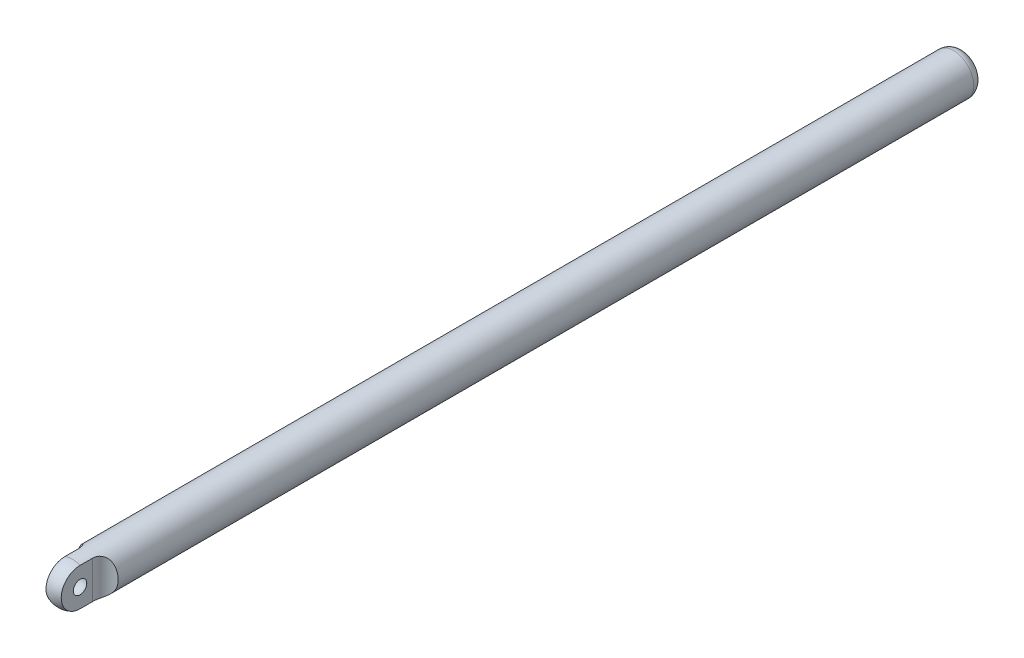
ISO-10303-21;
HEADER;
FILE_DESCRIPTION(('STEP AP214'),'2;1');
FILE_NAME('part.step','',(''),(''),'','','');
FILE_SCHEMA(('AUTOMOTIVE_DESIGN { 1 0 10303 214 1 1 1 1 }'));
ENDSEC;
DATA;
#1=APPLICATION_CONTEXT('core data for automotive mechanical design processes');
#2=APPLICATION_PROTOCOL_DEFINITION('international standard','automotive_design',2000,#1);
#3=PRODUCT_CONTEXT('',#1,'mechanical');
#4=PRODUCT('Part','Part','',(#3));
#5=PRODUCT_RELATED_PRODUCT_CATEGORY('part','',(#4));
#6=PRODUCT_DEFINITION_FORMATION('','',#4);
#7=PRODUCT_DEFINITION_CONTEXT('part definition',#1,'design');
#8=PRODUCT_DEFINITION('design','',#6,#7);
#9=PRODUCT_DEFINITION_SHAPE('','',#8);
#10=(LENGTH_UNIT() NAMED_UNIT(*) SI_UNIT(.MILLI.,.METRE.));
#11=(NAMED_UNIT(*) PLANE_ANGLE_UNIT() SI_UNIT($,.RADIAN.));
#12=(NAMED_UNIT(*) SI_UNIT($,.STERADIAN.) SOLID_ANGLE_UNIT());
#13=UNCERTAINTY_MEASURE_WITH_UNIT(LENGTH_MEASURE(1.E-05),#10,'distance_accuracy_value','');
#14=(GEOMETRIC_REPRESENTATION_CONTEXT(3) GLOBAL_UNCERTAINTY_ASSIGNED_CONTEXT((#13)) GLOBAL_UNIT_ASSIGNED_CONTEXT((#10,
#11,#12)) REPRESENTATION_CONTEXT('',''));
#15=CARTESIAN_POINT('',(0.,0.,0.));
#16=DIRECTION('',(0.,0.,1.));
#17=DIRECTION('',(1.,0.,0.));
#18=AXIS2_PLACEMENT_3D('',#15,#16,#17);
#19=CARTESIAN_POINT('',(0.,0.,351.1));
#20=DIRECTION('',(0.,0.,-1.));
#21=DIRECTION('',(-1.,0.,0.));
#22=AXIS2_PLACEMENT_3D('',#19,#20,#21);
#23=CYLINDRICAL_SURFACE('',#22,8.);
#24=CARTESIAN_POINT('',(0.,0.,4.));
#25=DIRECTION('',(0.,0.,1.));
#26=DIRECTION('',(1.,0.,0.));
#27=AXIS2_PLACEMENT_3D('',#24,#25,#26);
#28=CIRCLE('',#27,8.);
#29=CARTESIAN_POINT('',(8.,0.,4.));
#30=VERTEX_POINT('',#29);
#31=EDGE_CURVE('E108',#30,#30,#28,.T.);
#32=ORIENTED_EDGE('',*,*,#31,.T.);
#33=EDGE_LOOP('',(#32));
#34=FACE_BOUND('',#33,.T.);
#35=DIRECTION('',(0.,0.,-1.));
#36=VECTOR('',#35,1.);
#37=CARTESIAN_POINT('',(3.,-7.41619848709566,351.1));
#38=LINE('',#37,#36);
#39=CARTESIAN_POINT('',(3.,-7.41619848709566,351.1));
#40=VERTEX_POINT('',#39);
#41=CARTESIAN_POINT('',(3.,-7.41619848709566,346.1));
#42=VERTEX_POINT('',#41);
#43=EDGE_CURVE('E90',#40,#42,#38,.T.);
#44=ORIENTED_EDGE('',*,*,#43,.F.);
#45=CARTESIAN_POINT('',(0.,0.,351.1));
#46=DIRECTION('',(0.,0.,1.));
#47=DIRECTION('',(1.,0.,0.));
#48=AXIS2_PLACEMENT_3D('',#45,#46,#47);
#49=CIRCLE('',#48,8.);
#50=CARTESIAN_POINT('',(-3.,-7.41619848709566,351.1));
#51=VERTEX_POINT('',#50);
#52=EDGE_CURVE('E101',#51,#40,#49,.T.);
#53=ORIENTED_EDGE('',*,*,#52,.F.);
#54=DIRECTION('',(0.,0.,-1.));
#55=VECTOR('',#54,1.);
#56=CARTESIAN_POINT('',(-3.,-7.41619848709566,351.1));
#57=LINE('',#56,#55);
#58=CARTESIAN_POINT('',(-3.,-7.41619848709566,346.1));
#59=VERTEX_POINT('',#58);
#60=EDGE_CURVE('E117',#51,#59,#57,.T.);
#61=ORIENTED_EDGE('',*,*,#60,.T.);
#62=CARTESIAN_POINT('',(-3.,-7.41619848709566,346.1));
#63=CARTESIAN_POINT('',(-2.99998194882976,-7.41618096705285,345.971177061632));
#64=CARTESIAN_POINT('',(-3.00497786819728,-7.41418402823996,345.842353971101));
#65=CARTESIAN_POINT('',(-3.02486952777117,-7.40610410713607,345.585598718899));
#66=CARTESIAN_POINT('',(-3.03976562706393,-7.40002097663597,345.457666589715));
#67=CARTESIAN_POINT('',(-3.0793359113478,-7.38363879843656,345.20355285365));
#68=CARTESIAN_POINT('',(-3.10401325945122,-7.37333838689491,345.077371826726));
#69=CARTESIAN_POINT('',(-3.16288242047676,-7.34827900183658,344.827703273646));
#70=CARTESIAN_POINT('',(-3.19707393743654,-7.33352016700924,344.704215663833));
#71=CARTESIAN_POINT('',(-3.27464331438398,-7.29921285889115,344.460685014659));
#72=CARTESIAN_POINT('',(-3.31803147897494,-7.27965900902252,344.34064601214));
#73=CARTESIAN_POINT('',(-3.41346540886279,-7.23540040026642,344.105043124346));
#74=CARTESIAN_POINT('',(-3.46551097188766,-7.21069576171888,343.989479134595));
#75=CARTESIAN_POINT('',(-3.57756979179812,-7.15575868477292,343.76376948876));
#76=CARTESIAN_POINT('',(-3.63757655317329,-7.12553074530883,343.653619514755));
#77=CARTESIAN_POINT('',(-3.76479736496716,-7.0591391619461,343.439441504154));
#78=CARTESIAN_POINT('',(-3.83201123796436,-7.02297566415478,343.335413316951));
#79=CARTESIAN_POINT('',(-3.97157492861813,-6.94498928163802,343.135816819865));
#80=CARTESIAN_POINT('',(-4.04382479012859,-6.90326674201873,343.04013937972));
#81=CARTESIAN_POINT('',(-4.19336889552486,-6.81346173770795,342.855985770153));
#82=CARTESIAN_POINT('',(-4.2706630516339,-6.76537938366993,342.767509475482));
#83=CARTESIAN_POINT('',(-4.42917619875802,-6.66268067789855,342.598190777653));
#84=CARTESIAN_POINT('',(-4.51039535658367,-6.60806404831597,342.517348699379));
#85=CARTESIAN_POINT('',(-4.6755698352262,-6.49224295174608,342.363571465479));
#86=CARTESIAN_POINT('',(-4.75952518172602,-6.43103842290975,342.2906363841));
#87=CARTESIAN_POINT('',(-4.92871800997639,-6.30230143622583,342.152964574754));
#88=CARTESIAN_POINT('',(-5.0139509523302,-6.23478827798142,342.088204180751));
#89=CARTESIAN_POINT('',(-5.18478147239174,-6.09346613735861,341.966533728878));
#90=CARTESIAN_POINT('',(-5.27037904092626,-6.01965731248715,341.909623474704));
#91=CARTESIAN_POINT('',(-5.44087411333283,-5.86600867074744,341.803377243902));
#92=CARTESIAN_POINT('',(-5.52577151424527,-5.78616798383459,341.75404236308));
#93=CARTESIAN_POINT('',(-5.69389479796841,-5.62080741927391,341.662540885026));
#94=CARTESIAN_POINT('',(-5.77712033278823,-5.53528637491749,341.620375766788));
#95=CARTESIAN_POINT('',(-5.96957845036343,-5.32826770075513,341.529186410563));
#96=CARTESIAN_POINT('',(-6.0777827837662,-5.20460698040788,341.482881392081));
#97=CARTESIAN_POINT('',(-6.28790084602496,-4.94871111682007,341.400909908119));
#98=CARTESIAN_POINT('',(-6.38981273893175,-4.81647349395214,341.365246536035));
#99=CARTESIAN_POINT('',(-6.58622343407411,-4.54421479975277,341.302930825186));
#100=CARTESIAN_POINT('',(-6.68070809243919,-4.40417970593842,341.276295373783));
#101=CARTESIAN_POINT('',(-6.86110909142168,-4.11750952606279,341.230545324478));
#102=CARTESIAN_POINT('',(-6.94702359993419,-3.97087303845457,341.211432332146));
#103=CARTESIAN_POINT('',(-7.13015208307657,-3.63405768599302,341.175148655313));
#104=CARTESIAN_POINT('',(-7.2247219549862,-3.44225205310019,341.159694065235));
#105=CARTESIAN_POINT('',(-7.39833434257076,-3.05130048295832,341.135558283037));
#106=CARTESIAN_POINT('',(-7.47737206679697,-2.85215230306702,341.126879178613));
#107=CARTESIAN_POINT('',(-7.61922825910209,-2.4480985030995,341.114010970235));
#108=CARTESIAN_POINT('',(-7.6820519414675,-2.24319475752416,341.109820421434));
#109=CARTESIAN_POINT('',(-7.79104329491507,-1.82906797955355,341.10407065796));
#110=CARTESIAN_POINT('',(-7.83721690795037,-1.61984651627033,341.10251050384));
#111=CARTESIAN_POINT('',(-7.91656052534341,-1.17639857622754,341.100520220063));
#112=CARTESIAN_POINT('',(-7.94787850252648,-0.941834712386469,341.100224502896));
#113=CARTESIAN_POINT('',(-7.97916098716532,-0.588985804709407,341.100034384794));
#114=CARTESIAN_POINT('',(-7.98697273265946,-0.471344664553379,341.100013128681));
#115=CARTESIAN_POINT('',(-7.99739259860079,-0.235808045346252,341.099999093699));
#116=CARTESIAN_POINT('',(-7.99999965513553,-0.117912519224636,341.100006320649));
#117=CARTESIAN_POINT('',(-8.,0.,341.1));
#118=B_SPLINE_CURVE_WITH_KNOTS('',3,(#62,#63,#64,#65,#66,#67,#68,#69,#70,#71,#72,#73,#74,#75,
#76,#77,#78,#79,#80,#81,#82,#83,#84,#85,#86,#87,#88,#89,#90,#91,#92,#93,#94,#95,#96,#97,#98,#99,
#100,#101,#102,#103,#104,#105,#106,#107,#108,#109,#110,#111,#112,#113,#114,#115,#116,#117),
.UNSPECIFIED.,.F.,.F.,(4,2,2,2,2,2,2,2,2,2,2,2,2,2,2,2,2,2,2,2,2,2,2,2,2,2,2,4),(0.,
0.386357129072136,0.772728272349762,1.1592244644591,1.54570863496851,1.9326281619495,
2.31953865018729,2.70613537904259,3.0927225930147,3.47309396630354,3.85345872243815,
4.23383965812224,4.61422416523903,4.993480876017,5.37272810121374,5.75203013441183,
6.1314103161512,6.64281191115162,7.15436201979303,7.66686380513319,8.17947491805619,
8.82183344016124,9.46438981082349,10.1067392830653,10.748859290995,11.4577665415346,
11.8113690731066,12.1650438786666),.UNSPECIFIED.);
#119=CARTESIAN_POINT('',(-8.,0.,341.1));
#120=VERTEX_POINT('',#119);
#121=EDGE_CURVE('E11',#59,#120,#118,.T.);
#122=ORIENTED_EDGE('',*,*,#121,.T.);
#123=CARTESIAN_POINT('',(-8.,0.,341.1));
#124=CARTESIAN_POINT('',(-7.99999993634802,0.105590898577491,341.100004169011));
#125=CARTESIAN_POINT('',(-7.99790919883449,0.211170562631199,341.099999467842));
#126=CARTESIAN_POINT('',(-7.98955111469173,0.422164043564904,341.100008394338));
#127=CARTESIAN_POINT('',(-7.98328378352244,0.527577861057346,341.100022021935));
#128=CARTESIAN_POINT('',(-7.95822699071099,0.843318765558405,341.100144486313));
#129=CARTESIAN_POINT('',(-7.9331827260666,1.05318341235509,341.100334880221));
#130=CARTESIAN_POINT('',(-7.86634542338945,1.47167549475288,341.101674771502));
#131=CARTESIAN_POINT('',(-7.82443908771539,1.68028467228079,341.102830814856));
#132=CARTESIAN_POINT('',(-7.72414979201249,2.09349113572378,341.107362980372));
#133=CARTESIAN_POINT('',(-7.66576657183926,2.29808835824176,341.110739137587));
#134=CARTESIAN_POINT('',(-7.52894158126263,2.71399755647434,341.121737522843));
#135=CARTESIAN_POINT('',(-7.44950833935055,2.9249784059873,341.129601813349));
#136=CARTESIAN_POINT('',(-7.27325001708437,3.3392363392571,341.152300900211));
#137=CARTESIAN_POINT('',(-7.17642154377167,3.54251191070725,341.16713705735));
#138=CARTESIAN_POINT('',(-6.96683047170462,3.93869275041139,341.206750431037));
#139=CARTESIAN_POINT('',(-6.8541306101608,4.13163490783374,341.231489181372));
#140=CARTESIAN_POINT('',(-6.61411191836184,4.50586723663474,341.294307795581));
#141=CARTESIAN_POINT('',(-6.48680212792732,4.6871645060592,341.332379439397));
#142=CARTESIAN_POINT('',(-6.26635012856212,4.97528186998459,341.409269839622));
#143=CARTESIAN_POINT('',(-6.17670063322342,5.08609712266518,341.4432353453));
#144=CARTESIAN_POINT('',(-5.99312946564096,5.30116600959399,341.519351676194));
#145=CARTESIAN_POINT('',(-5.89920906948126,5.40542158187627,341.561500068627));
#146=CARTESIAN_POINT('',(-5.70825827882474,5.60669455264395,341.654867207908));
#147=CARTESIAN_POINT('',(-5.6112294055359,5.70371541653058,341.706081572003));
#148=CARTESIAN_POINT('',(-5.41538428380538,5.88998073897382,341.818353396964));
#149=CARTESIAN_POINT('',(-5.31656799052774,5.97922500213326,341.879411105047));
#150=CARTESIAN_POINT('',(-5.11795671968779,6.15010701316212,342.012431120522));
#151=CARTESIAN_POINT('',(-5.01816017852227,6.23167908624495,342.084475778608));
#152=CARTESIAN_POINT('',(-4.82016559467587,6.38606025098085,342.239372196157));
#153=CARTESIAN_POINT('',(-4.72196756699294,6.4588692604559,342.322224056952));
#154=CARTESIAN_POINT('',(-4.52908422092302,6.59555684011479,342.498636560114));
#155=CARTESIAN_POINT('',(-4.43439798708288,6.65943774986474,342.592194385303));
#156=CARTESIAN_POINT('',(-4.25038684548178,6.77836387162581,342.789622054764));
#157=CARTESIAN_POINT('',(-4.16106133124359,6.83341008432183,342.893490728991));
#158=CARTESIAN_POINT('',(-4.00002292575877,6.92874273737835,343.097509002474));
#159=CARTESIAN_POINT('',(-3.9274923887715,6.97001105021593,343.196558263437));
#160=CARTESIAN_POINT('',(-3.78895813628082,7.04627916161328,343.401405669518));
#161=CARTESIAN_POINT('',(-3.72295425299788,7.08127912133129,343.507203641033));
#162=CARTESIAN_POINT('',(-3.59836963004581,7.14539359756557,343.724840957832));
#163=CARTESIAN_POINT('',(-3.53979191498217,7.17450571887853,343.836682738418));
#164=CARTESIAN_POINT('',(-3.43085959026302,7.22723089842974,344.065542749084));
#165=CARTESIAN_POINT('',(-3.38050480367211,7.25084407499522,344.182560867714));
#166=CARTESIAN_POINT('',(-3.28976794622583,7.29245207607916,344.417967061106));
#167=CARTESIAN_POINT('',(-3.24917093042018,7.31057087513551,344.536250535755));
#168=CARTESIAN_POINT('',(-3.17683382647123,7.34229447154521,344.776083436988));
#169=CARTESIAN_POINT('',(-3.14509355584091,7.35589936190556,344.897632796225));
#170=CARTESIAN_POINT('',(-3.09084104909216,7.37885953007686,345.142962890584));
#171=CARTESIAN_POINT('',(-3.06831464655881,7.38822133408962,345.266739892411));
#172=CARTESIAN_POINT('',(-3.03265119192015,7.40293196225855,345.515824860602));
#173=CARTESIAN_POINT('',(-3.01950922431935,7.40828288735562,345.64113199046));
#174=CARTESIAN_POINT('',(-3.00740992325215,7.41319752069493,345.822258731533));
#175=CARTESIAN_POINT('',(-3.00462970342662,7.41432433240352,345.877806790206));
#176=CARTESIAN_POINT('',(-3.0009260170494,7.41582403166414,345.988901217524));
#177=CARTESIAN_POINT('',(-3.00000009412967,7.41619791661415,346.044447490802));
#178=CARTESIAN_POINT('',(-3.,7.41619848709566,346.1));
#179=B_SPLINE_CURVE_WITH_KNOTS('',3,(#123,#124,#125,#126,#127,#128,#129,#130,#131,#132,#133,
#134,#135,#136,#137,#138,#139,#140,#141,#142,#143,#144,#145,#146,#147,#148,#149,#150,#151,#152,
#153,#154,#155,#156,#157,#158,#159,#160,#161,#162,#163,#164,#165,#166,#167,#168,#169,#170,#171,
#172,#173,#174,#175,#176,#177,#178),.UNSPECIFIED.,.F.,.F.,(4,2,2,2,2,2,2,2,2,2,2,2,2,2,2,2,2,2,
2,2,2,2,2,2,2,2,2,4),(0.,0.316729562177747,0.633457951965692,1.26680073250047,1.90447201617216,
2.54215336824463,3.21800469590686,3.89398799250792,4.56737055336253,5.24033868603008,
5.67954341079974,6.11861775881925,6.55748042240496,6.99635410980625,7.43869556038723,
7.88104115882278,8.32327062448777,8.76544996448038,9.15351841954077,9.5415768959981,
9.92979292053024,10.3180005905923,10.6966537499446,11.0752991068382,11.4533600842844,
11.8312228907269,11.9980801523305,12.1647162332401),.UNSPECIFIED.);
#180=CARTESIAN_POINT('',(-3.,7.41619848709566,346.1));
#181=VERTEX_POINT('',#180);
#182=EDGE_CURVE('E50',#120,#181,#179,.T.);
#183=ORIENTED_EDGE('',*,*,#182,.T.);
#184=DIRECTION('',(0.,0.,-1.));
#185=VECTOR('',#184,1.);
#186=CARTESIAN_POINT('',(-3.,7.41619848709566,351.1));
#187=LINE('',#186,#185);
#188=CARTESIAN_POINT('',(-3.,7.41619848709566,351.1));
#189=VERTEX_POINT('',#188);
#190=EDGE_CURVE('E103',#181,#189,#187,.F.);
#191=ORIENTED_EDGE('',*,*,#190,.T.);
#192=CARTESIAN_POINT('',(3.,7.41619848709566,351.1));
#193=VERTEX_POINT('',#192);
#194=EDGE_CURVE('E109',#193,#189,#49,.T.);
#195=ORIENTED_EDGE('',*,*,#194,.F.);
#196=DIRECTION('',(0.,0.,-1.));
#197=VECTOR('',#196,1.);
#198=CARTESIAN_POINT('',(3.,7.41619848709566,351.1));
#199=LINE('',#198,#197);
#200=CARTESIAN_POINT('',(3.,7.41619848709566,346.1));
#201=VERTEX_POINT('',#200);
#202=EDGE_CURVE('E92',#201,#193,#199,.F.);
#203=ORIENTED_EDGE('',*,*,#202,.F.);
#204=CARTESIAN_POINT('',(3.,7.41619848709566,346.1));
#205=CARTESIAN_POINT('',(2.99998194882976,7.41618096705285,345.971177061632));
#206=CARTESIAN_POINT('',(3.00497786819728,7.41418402823996,345.842353971101));
#207=CARTESIAN_POINT('',(3.02486952777117,7.40610410713607,345.585598718899));
#208=CARTESIAN_POINT('',(3.03976562706393,7.40002097663597,345.457666589715));
#209=CARTESIAN_POINT('',(3.0793359113478,7.38363879843656,345.20355285365));
#210=CARTESIAN_POINT('',(3.10401325945122,7.37333838689491,345.077371826726));
#211=CARTESIAN_POINT('',(3.16288242047676,7.34827900183658,344.827703273646));
#212=CARTESIAN_POINT('',(3.19707393743654,7.33352016700924,344.704215663833));
#213=CARTESIAN_POINT('',(3.27464331438398,7.29921285889115,344.460685014659));
#214=CARTESIAN_POINT('',(3.31803147897494,7.27965900902252,344.34064601214));
#215=CARTESIAN_POINT('',(3.41346540886279,7.23540040026642,344.105043124346));
#216=CARTESIAN_POINT('',(3.46551097188766,7.21069576171888,343.989479134595));
#217=CARTESIAN_POINT('',(3.57756979179812,7.15575868477292,343.76376948876));
#218=CARTESIAN_POINT('',(3.63757655317329,7.12553074530883,343.653619514755));
#219=CARTESIAN_POINT('',(3.76479736496716,7.0591391619461,343.439441504154));
#220=CARTESIAN_POINT('',(3.83201123796436,7.02297566415478,343.335413316951));
#221=CARTESIAN_POINT('',(3.97157492861813,6.94498928163802,343.135816819865));
#222=CARTESIAN_POINT('',(4.04382479012859,6.90326674201873,343.04013937972));
#223=CARTESIAN_POINT('',(4.19336889552486,6.81346173770795,342.855985770153));
#224=CARTESIAN_POINT('',(4.2706630516339,6.76537938366993,342.767509475482));
#225=CARTESIAN_POINT('',(4.42917619875802,6.66268067789855,342.598190777653));
#226=CARTESIAN_POINT('',(4.51039535658367,6.60806404831597,342.517348699379));
#227=CARTESIAN_POINT('',(4.6755698352262,6.49224295174608,342.363571465479));
#228=CARTESIAN_POINT('',(4.75952518172602,6.43103842290975,342.2906363841));
#229=CARTESIAN_POINT('',(4.92871800997639,6.30230143622583,342.152964574754));
#230=CARTESIAN_POINT('',(5.0139509523302,6.23478827798142,342.088204180751));
#231=CARTESIAN_POINT('',(5.18478147239174,6.09346613735861,341.966533728878));
#232=CARTESIAN_POINT('',(5.27037904092626,6.01965731248715,341.909623474704));
#233=CARTESIAN_POINT('',(5.44087411333283,5.86600867074744,341.803377243902));
#234=CARTESIAN_POINT('',(5.52577151424527,5.78616798383459,341.75404236308));
#235=CARTESIAN_POINT('',(5.69389479796841,5.62080741927391,341.662540885026));
#236=CARTESIAN_POINT('',(5.77712033278823,5.53528637491749,341.620375766788));
#237=CARTESIAN_POINT('',(5.96957845036343,5.32826770075513,341.529186410563));
#238=CARTESIAN_POINT('',(6.0777827837662,5.20460698040788,341.482881392081));
#239=CARTESIAN_POINT('',(6.28790084602496,4.94871111682007,341.400909908119));
#240=CARTESIAN_POINT('',(6.38981273893175,4.81647349395214,341.365246536035));
#241=CARTESIAN_POINT('',(6.58622343407411,4.54421479975277,341.302930825186));
#242=CARTESIAN_POINT('',(6.68070809243919,4.40417970593842,341.276295373783));
#243=CARTESIAN_POINT('',(6.86110909142168,4.11750952606279,341.230545324478));
#244=CARTESIAN_POINT('',(6.94702359993419,3.97087303845457,341.211432332146));
#245=CARTESIAN_POINT('',(7.13015208307657,3.63405768599302,341.175148655313));
#246=CARTESIAN_POINT('',(7.2247219549862,3.44225205310019,341.159694065235));
#247=CARTESIAN_POINT('',(7.39833434257076,3.05130048295832,341.135558283037));
#248=CARTESIAN_POINT('',(7.47737206679697,2.85215230306702,341.126879178613));
#249=CARTESIAN_POINT('',(7.61922825910209,2.4480985030995,341.114010970235));
#250=CARTESIAN_POINT('',(7.6820519414675,2.24319475752416,341.109820421434));
#251=CARTESIAN_POINT('',(7.79104329491507,1.82906797955355,341.10407065796));
#252=CARTESIAN_POINT('',(7.83721690795037,1.61984651627033,341.10251050384));
#253=CARTESIAN_POINT('',(7.91656052534341,1.17639857622754,341.100520220063));
#254=CARTESIAN_POINT('',(7.94787850252648,0.941834712386469,341.100224502896));
#255=CARTESIAN_POINT('',(7.97916098716532,0.588985804709407,341.100034384794));
#256=CARTESIAN_POINT('',(7.98697273265946,0.471344664553379,341.100013128681));
#257=CARTESIAN_POINT('',(7.99739259860079,0.235808045346252,341.099999093699));
#258=CARTESIAN_POINT('',(7.99999965513553,0.117912519224636,341.100006320649));
#259=CARTESIAN_POINT('',(8.,0.,341.1));
#260=B_SPLINE_CURVE_WITH_KNOTS('',3,(#204,#205,#206,#207,#208,#209,#210,#211,#212,#213,#214,
#215,#216,#217,#218,#219,#220,#221,#222,#223,#224,#225,#226,#227,#228,#229,#230,#231,#232,#233,
#234,#235,#236,#237,#238,#239,#240,#241,#242,#243,#244,#245,#246,#247,#248,#249,#250,#251,#252,
#253,#254,#255,#256,#257,#258,#259),.UNSPECIFIED.,.F.,.F.,(4,2,2,2,2,2,2,2,2,2,2,2,2,2,2,2,2,2,
2,2,2,2,2,2,2,2,2,4),(0.,0.386357129072136,0.772728272349762,1.1592244644591,1.54570863496851,
1.9326281619495,2.31953865018729,2.70613537904259,3.0927225930147,3.47309396630354,
3.85345872243815,4.23383965812224,4.61422416523903,4.993480876017,5.37272810121374,
5.75203013441183,6.1314103161512,6.64281191115162,7.15436201979303,7.66686380513319,
8.17947491805619,8.82183344016124,9.46438981082349,10.1067392830653,10.748859290995,
11.4577665415346,11.8113690731066,12.1650438786666),.UNSPECIFIED.);
#261=CARTESIAN_POINT('',(8.,0.,341.1));
#262=VERTEX_POINT('',#261);
#263=EDGE_CURVE('E62',#201,#262,#260,.T.);
#264=ORIENTED_EDGE('',*,*,#263,.T.);
#265=CARTESIAN_POINT('',(8.,0.,341.1));
#266=CARTESIAN_POINT('',(7.99999993634802,-0.105590898577491,341.100004169011));
#267=CARTESIAN_POINT('',(7.99790919883449,-0.211170562631199,341.099999467842));
#268=CARTESIAN_POINT('',(7.98955111469173,-0.422164043564904,341.100008394338));
#269=CARTESIAN_POINT('',(7.98328378352244,-0.527577861057346,341.100022021935));
#270=CARTESIAN_POINT('',(7.95822699071099,-0.843318765558405,341.100144486313));
#271=CARTESIAN_POINT('',(7.9331827260666,-1.05318341235509,341.100334880221));
#272=CARTESIAN_POINT('',(7.86634542338945,-1.47167549475288,341.101674771502));
#273=CARTESIAN_POINT('',(7.82443908771539,-1.68028467228079,341.102830814856));
#274=CARTESIAN_POINT('',(7.72414979201249,-2.09349113572378,341.107362980372));
#275=CARTESIAN_POINT('',(7.66576657183926,-2.29808835824176,341.110739137587));
#276=CARTESIAN_POINT('',(7.52894158126263,-2.71399755647434,341.121737522843));
#277=CARTESIAN_POINT('',(7.44950833935055,-2.9249784059873,341.129601813349));
#278=CARTESIAN_POINT('',(7.27325001708437,-3.3392363392571,341.152300900211));
#279=CARTESIAN_POINT('',(7.17642154377167,-3.54251191070725,341.16713705735));
#280=CARTESIAN_POINT('',(6.96683047170462,-3.93869275041139,341.206750431037));
#281=CARTESIAN_POINT('',(6.8541306101608,-4.13163490783374,341.231489181372));
#282=CARTESIAN_POINT('',(6.61411191836184,-4.50586723663474,341.294307795581));
#283=CARTESIAN_POINT('',(6.48680212792732,-4.6871645060592,341.332379439397));
#284=CARTESIAN_POINT('',(6.26635012856212,-4.97528186998459,341.409269839622));
#285=CARTESIAN_POINT('',(6.17670063322342,-5.08609712266518,341.4432353453));
#286=CARTESIAN_POINT('',(5.99312946564096,-5.30116600959399,341.519351676194));
#287=CARTESIAN_POINT('',(5.89920906948126,-5.40542158187627,341.561500068627));
#288=CARTESIAN_POINT('',(5.70825827882474,-5.60669455264395,341.654867207908));
#289=CARTESIAN_POINT('',(5.6112294055359,-5.70371541653058,341.706081572003));
#290=CARTESIAN_POINT('',(5.41538428380538,-5.88998073897382,341.818353396964));
#291=CARTESIAN_POINT('',(5.31656799052774,-5.97922500213326,341.879411105047));
#292=CARTESIAN_POINT('',(5.11795671968779,-6.15010701316212,342.012431120522));
#293=CARTESIAN_POINT('',(5.01816017852227,-6.23167908624495,342.084475778608));
#294=CARTESIAN_POINT('',(4.82016559467587,-6.38606025098085,342.239372196157));
#295=CARTESIAN_POINT('',(4.72196756699294,-6.4588692604559,342.322224056952));
#296=CARTESIAN_POINT('',(4.52908422092302,-6.59555684011479,342.498636560114));
#297=CARTESIAN_POINT('',(4.43439798708288,-6.65943774986474,342.592194385303));
#298=CARTESIAN_POINT('',(4.25038684548178,-6.77836387162581,342.789622054764));
#299=CARTESIAN_POINT('',(4.16106133124359,-6.83341008432183,342.893490728991));
#300=CARTESIAN_POINT('',(4.00002292575877,-6.92874273737835,343.097509002474));
#301=CARTESIAN_POINT('',(3.9274923887715,-6.97001105021593,343.196558263437));
#302=CARTESIAN_POINT('',(3.78895813628082,-7.04627916161328,343.401405669518));
#303=CARTESIAN_POINT('',(3.72295425299788,-7.08127912133129,343.507203641033));
#304=CARTESIAN_POINT('',(3.59836963004581,-7.14539359756557,343.724840957832));
#305=CARTESIAN_POINT('',(3.53979191498217,-7.17450571887853,343.836682738418));
#306=CARTESIAN_POINT('',(3.43085959026302,-7.22723089842974,344.065542749084));
#307=CARTESIAN_POINT('',(3.38050480367211,-7.25084407499522,344.182560867714));
#308=CARTESIAN_POINT('',(3.28976794622583,-7.29245207607916,344.417967061106));
#309=CARTESIAN_POINT('',(3.24917093042018,-7.31057087513551,344.536250535755));
#310=CARTESIAN_POINT('',(3.17683382647123,-7.34229447154521,344.776083436988));
#311=CARTESIAN_POINT('',(3.14509355584091,-7.35589936190556,344.897632796225));
#312=CARTESIAN_POINT('',(3.09084104909216,-7.37885953007686,345.142962890584));
#313=CARTESIAN_POINT('',(3.06831464655881,-7.38822133408962,345.266739892411));
#314=CARTESIAN_POINT('',(3.03265119192015,-7.40293196225855,345.515824860602));
#315=CARTESIAN_POINT('',(3.01950922431935,-7.40828288735562,345.64113199046));
#316=CARTESIAN_POINT('',(3.00740992325215,-7.41319752069493,345.822258731533));
#317=CARTESIAN_POINT('',(3.00462970342662,-7.41432433240352,345.877806790206));
#318=CARTESIAN_POINT('',(3.0009260170494,-7.41582403166414,345.988901217524));
#319=CARTESIAN_POINT('',(3.00000009412967,-7.41619791661415,346.044447490802));
#320=CARTESIAN_POINT('',(3.,-7.41619848709566,346.1));
#321=B_SPLINE_CURVE_WITH_KNOTS('',3,(#265,#266,#267,#268,#269,#270,#271,#272,#273,#274,#275,
#276,#277,#278,#279,#280,#281,#282,#283,#284,#285,#286,#287,#288,#289,#290,#291,#292,#293,#294,
#295,#296,#297,#298,#299,#300,#301,#302,#303,#304,#305,#306,#307,#308,#309,#310,#311,#312,#313,
#314,#315,#316,#317,#318,#319,#320),.UNSPECIFIED.,.F.,.F.,(4,2,2,2,2,2,2,2,2,2,2,2,2,2,2,2,2,2,
2,2,2,2,2,2,2,2,2,4),(0.,0.316729562177747,0.633457951965692,1.26680073250047,1.90447201617216,
2.54215336824463,3.21800469590686,3.89398799250792,4.56737055336253,5.24033868603008,
5.67954341079974,6.11861775881925,6.55748042240496,6.99635410980625,7.43869556038723,
7.88104115882278,8.32327062448777,8.76544996448038,9.15351841954077,9.5415768959981,
9.92979292053024,10.3180005905923,10.6966537499446,11.0752991068382,11.4533600842844,
11.8312228907269,11.9980801523305,12.1647162332401),.UNSPECIFIED.);
#322=EDGE_CURVE('E102',#262,#42,#321,.T.);
#323=ORIENTED_EDGE('',*,*,#322,.T.);
#324=EDGE_LOOP('',(#44,#53,#61,#122,#183,#191,#195,#203,#264,#323));
#325=FACE_BOUND('',#324,.T.);
#326=ADVANCED_FACE('F37',(#34,#325),#23,.T.);
#327=CARTESIAN_POINT('',(0.,0.,351.1));
#328=DIRECTION('',(-0.184955330817272,0.982746928564152,0.));
#329=DIRECTION('',(-0.982746928564152,-0.184955330817272,0.));
#330=AXIS2_PLACEMENT_3D('',#327,#328,#329);
#331=SPHERICAL_SURFACE('',#330,8.);
#332=CARTESIAN_POINT('',(3.,0.,351.1));
#333=DIRECTION('',(1.,0.,0.));
#334=DIRECTION('',(0.,0.,-1.));
#335=AXIS2_PLACEMENT_3D('',#332,#333,#334);
#336=CIRCLE('',#335,7.41619848709566);
#337=EDGE_CURVE('E86',#193,#40,#336,.T.);
#338=ORIENTED_EDGE('',*,*,#337,.F.);
#339=ORIENTED_EDGE('',*,*,#194,.T.);
#340=CARTESIAN_POINT('',(-3.,0.,351.1));
#341=DIRECTION('',(1.,0.,0.));
#342=DIRECTION('',(0.,0.,-1.));
#343=AXIS2_PLACEMENT_3D('',#340,#341,#342);
#344=CIRCLE('',#343,7.41619848709566);
#345=EDGE_CURVE('E98',#189,#51,#344,.T.);
#346=ORIENTED_EDGE('',*,*,#345,.T.);
#347=ORIENTED_EDGE('',*,*,#52,.T.);
#348=EDGE_LOOP('',(#338,#339,#346,#347));
#349=FACE_BOUND('',#348,.T.);
#350=ADVANCED_FACE('F106',(#349),#331,.T.);
#351=CARTESIAN_POINT('',(0.,0.,0.));
#352=DIRECTION('',(0.,0.,1.));
#353=DIRECTION('',(1.,0.,0.));
#354=AXIS2_PLACEMENT_3D('',#351,#352,#353);
#355=PLANE('',#354);
#356=CARTESIAN_POINT('',(0.,0.,0.));
#357=DIRECTION('',(0.,0.,1.));
#358=DIRECTION('',(1.,0.,0.));
#359=AXIS2_PLACEMENT_3D('',#356,#357,#358);
#360=CIRCLE('',#359,4.);
#361=CARTESIAN_POINT('',(4.,0.,0.));
#362=VERTEX_POINT('',#361);
#363=EDGE_CURVE('E112',#362,#362,#360,.F.);
#364=ORIENTED_EDGE('',*,*,#363,.T.);
#365=EDGE_LOOP('',(#364));
#366=FACE_BOUND('',#365,.T.);
#367=CARTESIAN_POINT('',(0.,0.,0.));
#368=DIRECTION('',(0.,0.,1.));
#369=DIRECTION('',(1.,0.,0.));
#370=AXIS2_PLACEMENT_3D('',#367,#368,#369);
#371=CIRCLE('',#370,3.87298334620742);
#372=CARTESIAN_POINT('',(3.87298334620742,0.,0.));
#373=VERTEX_POINT('',#372);
#374=EDGE_CURVE('E114',#373,#373,#371,.F.);
#375=ORIENTED_EDGE('',*,*,#374,.F.);
#376=EDGE_LOOP('',(#375));
#377=FACE_BOUND('',#376,.T.);
#378=ADVANCED_FACE('F159',(#366,#377),#355,.F.);
#379=CARTESIAN_POINT('',(0.,0.,1.));
#380=DIRECTION('',(1.,0.,0.));
#381=DIRECTION('',(0.,0.,1.));
#382=AXIS2_PLACEMENT_3D('',#379,#380,#381);
#383=SPHERICAL_SURFACE('',#382,4.);
#384=CARTESIAN_POINT('',(0.,0.,1.));
#385=DIRECTION('',(0.,0.,1.));
#386=DIRECTION('',(1.,0.,0.));
#387=AXIS2_PLACEMENT_3D('',#384,#385,#386);
#388=SPHERICAL_SURFACE('',#387,4.);
#389=ORIENTED_EDGE('',*,*,#374,.T.);
#390=EDGE_LOOP('',(#389));
#391=FACE_BOUND('',#390,.T.);
#392=ADVANCED_FACE('F151',(#391),#388,.F.);
#393=CARTESIAN_POINT('',(0.,0.,4.));
#394=DIRECTION('',(0.,0.,1.));
#395=DIRECTION('',(1.,0.,0.));
#396=AXIS2_PLACEMENT_3D('',#393,#394,#395);
#397=DEGENERATE_TOROIDAL_SURFACE('',#396,4.,4.,.T.);
#398=ORIENTED_EDGE('',*,*,#363,.F.);
#399=EDGE_LOOP('',(#398));
#400=FACE_BOUND('',#399,.T.);
#401=ORIENTED_EDGE('',*,*,#31,.F.);
#402=EDGE_LOOP('',(#401));
#403=FACE_BOUND('',#402,.T.);
#404=ADVANCED_FACE('F147',(#400,#403),#397,.T.);
#405=CARTESIAN_POINT('',(-3.,-8.,361.1));
#406=DIRECTION('',(1.,0.,0.));
#407=DIRECTION('',(0.,0.,-1.));
#408=AXIS2_PLACEMENT_3D('',#405,#406,#407);
#409=PLANE('',#408);
#410=CARTESIAN_POINT('',(-3.,0.,351.1));
#411=DIRECTION('',(1.,0.,0.));
#412=DIRECTION('',(0.,0.,-1.));
#413=AXIS2_PLACEMENT_3D('',#410,#411,#412);
#414=CIRCLE('',#413,2.64575131106459);
#415=CARTESIAN_POINT('',(-3.,-2.64575131106459,351.1));
#416=VERTEX_POINT('',#415);
#417=EDGE_CURVE('E127',#416,#416,#414,.T.);
#418=ORIENTED_EDGE('',*,*,#417,.T.);
#419=EDGE_LOOP('',(#418));
#420=FACE_BOUND('',#419,.T.);
#421=ORIENTED_EDGE('',*,*,#190,.F.);
#422=DIRECTION('',(0.,1.,0.));
#423=VECTOR('',#422,1.);
#424=CARTESIAN_POINT('',(-3.,-8.,346.1));
#425=LINE('',#424,#423);
#426=EDGE_CURVE('E129',#181,#59,#425,.F.);
#427=ORIENTED_EDGE('',*,*,#426,.T.);
#428=ORIENTED_EDGE('',*,*,#60,.F.);
#429=ORIENTED_EDGE('',*,*,#345,.F.);
#430=EDGE_LOOP('',(#421,#427,#428,#429));
#431=FACE_BOUND('',#430,.T.);
#432=ADVANCED_FACE('F150',(#420,#431),#409,.F.);
#433=CARTESIAN_POINT('',(3.,-8.,361.1));
#434=DIRECTION('',(1.,0.,0.));
#435=DIRECTION('',(0.,0.,-1.));
#436=AXIS2_PLACEMENT_3D('',#433,#434,#435);
#437=PLANE('',#436);
#438=CARTESIAN_POINT('',(3.,0.,351.1));
#439=DIRECTION('',(1.,0.,0.));
#440=DIRECTION('',(0.,0.,-1.));
#441=AXIS2_PLACEMENT_3D('',#438,#439,#440);
#442=CIRCLE('',#441,2.64575131106459);
#443=CARTESIAN_POINT('',(3.,-2.64575131106459,351.1));
#444=VERTEX_POINT('',#443);
#445=EDGE_CURVE('E124',#444,#444,#442,.T.);
#446=ORIENTED_EDGE('',*,*,#445,.F.);
#447=EDGE_LOOP('',(#446));
#448=FACE_BOUND('',#447,.T.);
#449=ORIENTED_EDGE('',*,*,#43,.T.);
#450=DIRECTION('',(0.,1.,0.));
#451=VECTOR('',#450,1.);
#452=CARTESIAN_POINT('',(3.,-8.,346.1));
#453=LINE('',#452,#451);
#454=EDGE_CURVE('E97',#42,#201,#453,.T.);
#455=ORIENTED_EDGE('',*,*,#454,.T.);
#456=ORIENTED_EDGE('',*,*,#202,.T.);
#457=ORIENTED_EDGE('',*,*,#337,.T.);
#458=EDGE_LOOP('',(#449,#455,#456,#457));
#459=FACE_BOUND('',#458,.T.);
#460=ADVANCED_FACE('F88',(#448,#459),#437,.T.);
#461=CARTESIAN_POINT('',(0.,0.,351.1));
#462=DIRECTION('',(1.,0.,0.));
#463=DIRECTION('',(0.,-1.,0.));
#464=AXIS2_PLACEMENT_3D('',#461,#462,#463);
#465=SPHERICAL_SURFACE('',#464,4.);
#466=CARTESIAN_POINT('',(3.,-2.64575131106459,351.1));
#467=CARTESIAN_POINT('',(2.95325632278245,-2.69875651187134,351.1));
#468=CARTESIAN_POINT('',(2.90510527447021,-2.75052029684331,351.1));
#469=CARTESIAN_POINT('',(2.80612960257577,-2.85142545255604,351.1));
#470=CARTESIAN_POINT('',(2.75530497899356,-2.90056682329681,351.1));
#471=CARTESIAN_POINT('',(2.65112332347855,-2.99608756798547,351.1));
#472=CARTESIAN_POINT('',(2.59776629154575,-3.04246694193337,351.1));
#473=CARTESIAN_POINT('',(2.48867011130152,-3.13233384188064,351.1));
#474=CARTESIAN_POINT('',(2.4329309629901,-3.17582136788002,351.1));
#475=CARTESIAN_POINT('',(2.31922699358693,-3.2597823144284,351.1));
#476=CARTESIAN_POINT('',(2.26126217249517,-3.3002557349774,351.1));
#477=CARTESIAN_POINT('',(2.14326969696134,-3.37807482070356,351.1));
#478=CARTESIAN_POINT('',(2.08324204251927,-3.41542048588072,351.1));
#479=CARTESIAN_POINT('',(1.9612924949961,-3.48687915806733,351.1));
#480=CARTESIAN_POINT('',(1.89937060191501,-3.52099216507678,351.1));
#481=CARTESIAN_POINT('',(1.77380650264688,-3.58588970804608,351.1));
#482=CARTESIAN_POINT('',(1.71016429645984,-3.61667424400594,351.1));
#483=CARTESIAN_POINT('',(1.58133832566934,-3.67482837812324,351.1));
#484=CARTESIAN_POINT('',(1.51615456106587,-3.70219797628069,351.1));
#485=CARTESIAN_POINT('',(1.38442855873451,-3.75344536048972,351.1));
#486=CARTESIAN_POINT('',(1.3178863210066,-3.7773231465413,351.1));
#487=CARTESIAN_POINT('',(1.18363027313511,-3.82151983967928,351.1));
#488=CARTESIAN_POINT('',(1.11591646299151,-3.84183874676568,351.1));
#489=CARTESIAN_POINT('',(0.97950746170912,-3.87886061118061,351.1));
#490=CARTESIAN_POINT('',(0.910812270570316,-3.89556356850914,351.1));
#491=CARTESIAN_POINT('',(0.77263345516107,-3.92530661891354,351.1));
#492=CARTESIAN_POINT('',(0.703149830890627,-3.93834671198941,351.1));
#493=CARTESIAN_POINT('',(0.563589311599921,-3.96072740748069,351.1));
#494=CARTESIAN_POINT('',(0.493512416579659,-3.9700680098961,351.1));
#495=CARTESIAN_POINT('',(0.352962184521471,-3.98502348861544,351.1));
#496=CARTESIAN_POINT('',(0.282488847483545,-3.99063836491936,351.1));
#497=CARTESIAN_POINT('',(0.141343673630413,-3.99812662061164,351.1));
#498=CARTESIAN_POINT('',(0.0706718368152065,-4.,351.1));
#499=CARTESIAN_POINT('',(-0.0706718368152065,-4.,351.1));
#500=CARTESIAN_POINT('',(-0.141343673630413,-3.99812662061164,351.1));
#501=CARTESIAN_POINT('',(-0.282488847483545,-3.99063836491936,351.1));
#502=CARTESIAN_POINT('',(-0.352962184521471,-3.98502348861544,351.1));
#503=CARTESIAN_POINT('',(-0.493512416579659,-3.9700680098961,351.1));
#504=CARTESIAN_POINT('',(-0.563589311599922,-3.96072740748069,351.1));
#505=CARTESIAN_POINT('',(-0.703149830890628,-3.93834671198941,351.1));
#506=CARTESIAN_POINT('',(-0.772633455161071,-3.92530661891354,351.1));
#507=CARTESIAN_POINT('',(-0.910812270570317,-3.89556356850913,351.1));
#508=CARTESIAN_POINT('',(-0.979507461709119,-3.87886061118061,351.1));
#509=CARTESIAN_POINT('',(-1.11591646299151,-3.84183874676568,351.1));
#510=CARTESIAN_POINT('',(-1.18363027313511,-3.82151983967928,351.1));
#511=CARTESIAN_POINT('',(-1.3178863210066,-3.7773231465413,351.1));
#512=CARTESIAN_POINT('',(-1.38442855873451,-3.75344536048972,351.1));
#513=CARTESIAN_POINT('',(-1.51615456106587,-3.70219797628069,351.1));
#514=CARTESIAN_POINT('',(-1.58133832566934,-3.67482837812324,351.1));
#515=CARTESIAN_POINT('',(-1.71016429645984,-3.61667424400594,351.1));
#516=CARTESIAN_POINT('',(-1.77380650264688,-3.58588970804608,351.1));
#517=CARTESIAN_POINT('',(-1.89937060191501,-3.52099216507678,351.1));
#518=CARTESIAN_POINT('',(-1.9612924949961,-3.48687915806733,351.1));
#519=CARTESIAN_POINT('',(-2.08324204251927,-3.41542048588072,351.1));
#520=CARTESIAN_POINT('',(-2.14326969696134,-3.37807482070356,351.1));
#521=CARTESIAN_POINT('',(-2.26126217249517,-3.3002557349774,351.1));
#522=CARTESIAN_POINT('',(-2.31922699358693,-3.2597823144284,351.1));
#523=CARTESIAN_POINT('',(-2.4329309629901,-3.17582136788002,351.1));
#524=CARTESIAN_POINT('',(-2.48867011130152,-3.13233384188064,351.1));
#525=CARTESIAN_POINT('',(-2.59776629154575,-3.04246694193337,351.1));
#526=CARTESIAN_POINT('',(-2.65112332347855,-2.99608756798547,351.1));
#527=CARTESIAN_POINT('',(-2.75530497899356,-2.90056682329681,351.1));
#528=CARTESIAN_POINT('',(-2.80612960257577,-2.85142545255604,351.1));
#529=CARTESIAN_POINT('',(-2.90510527447022,-2.75052029684331,351.1));
#530=CARTESIAN_POINT('',(-2.95325632278245,-2.69875651187134,351.1));
#531=CARTESIAN_POINT('',(-3.,-2.64575131106459,351.1));
#532=B_SPLINE_CURVE_WITH_KNOTS('',3,(#466,#467,#468,#469,#470,#471,#472,#473,#474,#475,#476,
#477,#478,#479,#480,#481,#482,#483,#484,#485,#486,#487,#488,#489,#490,#491,#492,#493,#494,#495,
#496,#497,#498,#499,#500,#501,#502,#503,#504,#505,#506,#507,#508,#509,#510,#511,#512,#513,#514,
#515,#516,#517,#518,#519,#520,#521,#522,#523,#524,#525,#526,#527,#528,#529,#530,#531),
.UNSPECIFIED.,.F.,.F.,(4,2,2,2,2,2,2,2,2,2,2,2,2,2,2,2,2,2,2,2,2,2,2,2,2,2,2,2,2,2,2,2,4),(0.,
0.211990702333812,0.423981404667625,0.635972107001437,0.847962809335249,1.05995351166906,
1.27194421400287,1.48393491633669,1.6959256186705,1.90791632100431,2.11990702333812,
2.33189772567194,2.54388842800575,2.75587913033956,2.96786983267337,3.17986053500719,
3.391851237341,3.60384193967481,3.81583264200862,4.02782334434244,4.23981404667625,
4.45180474901006,4.66379545134387,4.87578615367768,5.0877768560115,5.29976755834531,
5.51175826067912,5.72374896301293,5.93573966534674,6.14773036768056,6.35972107001437,
6.57171177234818,6.78370247468199),.UNSPECIFIED.);
#533=EDGE_CURVE('BSEAM145',#444,#416,#532,.T.);
#534=ORIENTED_EDGE('',*,*,#445,.T.);
#535=ORIENTED_EDGE('',*,*,#417,.F.);
#536=ORIENTED_EDGE('',*,*,#533,.T.);
#537=ORIENTED_EDGE('',*,*,#533,.F.);
#538=EDGE_LOOP('',(#534,#536,#535,#537));
#539=FACE_BOUND('',#538,.T.);
#540=ADVANCED_FACE('F145',(#539),#465,.F.);
#541=CARTESIAN_POINT('',(8.,-8.,346.1));
#542=DIRECTION('',(0.,1.,0.));
#543=DIRECTION('',(0.,0.,1.));
#544=AXIS2_PLACEMENT_3D('',#541,#542,#543);
#545=CYLINDRICAL_SURFACE('',#544,5.);
#546=ORIENTED_EDGE('',*,*,#454,.F.);
#547=ORIENTED_EDGE('',*,*,#322,.F.);
#548=ORIENTED_EDGE('',*,*,#263,.F.);
#549=EDGE_LOOP('',(#546,#547,#548));
#550=FACE_BOUND('',#549,.T.);
#551=ADVANCED_FACE('F142',(#550),#545,.F.);
#552=CARTESIAN_POINT('',(-8.,-8.,346.1));
#553=DIRECTION('',(0.,1.,0.));
#554=DIRECTION('',(0.,0.,1.));
#555=AXIS2_PLACEMENT_3D('',#552,#553,#554);
#556=CYLINDRICAL_SURFACE('',#555,5.);
#557=ORIENTED_EDGE('',*,*,#121,.F.);
#558=ORIENTED_EDGE('',*,*,#426,.F.);
#559=ORIENTED_EDGE('',*,*,#182,.F.);
#560=EDGE_LOOP('',(#557,#558,#559));
#561=FACE_BOUND('',#560,.T.);
#562=ADVANCED_FACE('F39',(#561),#556,.F.);
#563=CLOSED_SHELL('',(#326,#350,#378,#392,#404,#432,#460,#540,#551,#562));
#564=MANIFOLD_SOLID_BREP('B2',#563);
#565=ADVANCED_BREP_SHAPE_REPRESENTATION('',(#18,#564),#14);
#566=SHAPE_DEFINITION_REPRESENTATION(#9,#565);
ENDSEC;
END-ISO-10303-21;
